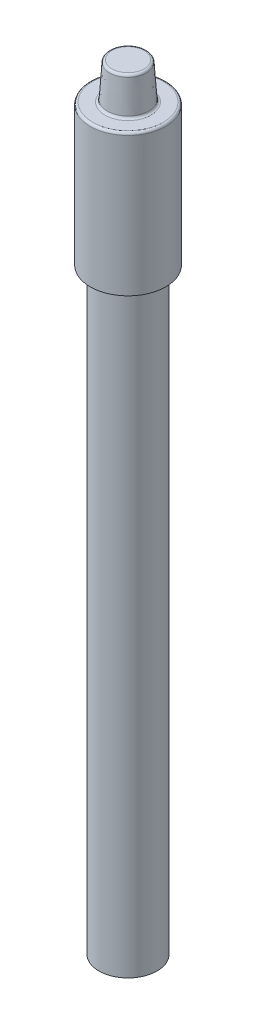
ISO-10303-21;
HEADER;
FILE_DESCRIPTION(('STEP AP214'),'2;1');
FILE_NAME('part.step','',(''),(''),'','','');
FILE_SCHEMA(('AUTOMOTIVE_DESIGN { 1 0 10303 214 1 1 1 1 }'));
ENDSEC;
DATA;
#1=APPLICATION_CONTEXT('core data for automotive mechanical design processes');
#2=APPLICATION_PROTOCOL_DEFINITION('international standard','automotive_design',2000,#1);
#3=PRODUCT_CONTEXT('',#1,'mechanical');
#4=PRODUCT('Part','Part','',(#3));
#5=PRODUCT_RELATED_PRODUCT_CATEGORY('part','',(#4));
#6=PRODUCT_DEFINITION_FORMATION('','',#4);
#7=PRODUCT_DEFINITION_CONTEXT('part definition',#1,'design');
#8=PRODUCT_DEFINITION('design','',#6,#7);
#9=PRODUCT_DEFINITION_SHAPE('','',#8);
#10=(LENGTH_UNIT() NAMED_UNIT(*) SI_UNIT(.MILLI.,.METRE.));
#11=(NAMED_UNIT(*) PLANE_ANGLE_UNIT() SI_UNIT($,.RADIAN.));
#12=(NAMED_UNIT(*) SI_UNIT($,.STERADIAN.) SOLID_ANGLE_UNIT());
#13=UNCERTAINTY_MEASURE_WITH_UNIT(LENGTH_MEASURE(1.E-05),#10,'distance_accuracy_value','');
#14=(GEOMETRIC_REPRESENTATION_CONTEXT(3) GLOBAL_UNCERTAINTY_ASSIGNED_CONTEXT((#13)) GLOBAL_UNIT_ASSIGNED_CONTEXT((#10,
#11,#12)) REPRESENTATION_CONTEXT('',''));
#15=CARTESIAN_POINT('',(0.,0.,0.));
#16=DIRECTION('',(0.,0.,1.));
#17=DIRECTION('',(1.,0.,0.));
#18=AXIS2_PLACEMENT_3D('',#15,#16,#17);
#19=CARTESIAN_POINT('',(0.,161.544,0.));
#20=DIRECTION('',(0.,1.,0.));
#21=DIRECTION('',(0.,0.,1.));
#22=AXIS2_PLACEMENT_3D('',#19,#20,#21);
#23=PLANE('',#22);
#24=CARTESIAN_POINT('',(0.,161.544,0.));
#25=DIRECTION('',(0.,1.,0.));
#26=DIRECTION('',(0.,0.,1.));
#27=AXIS2_PLACEMENT_3D('',#24,#25,#26);
#28=CIRCLE('',#27,3.3347390293191);
#29=CARTESIAN_POINT('',(0.,161.544,3.3347390293191));
#30=VERTEX_POINT('',#29);
#31=EDGE_CURVE('E154',#30,#30,#28,.T.);
#32=ORIENTED_EDGE('',*,*,#31,.T.);
#33=EDGE_LOOP('',(#32));
#34=FACE_BOUND('',#33,.T.);
#35=ADVANCED_FACE('F38',(#34),#23,.T.);
#36=CARTESIAN_POINT('',(0.,153.924,0.));
#37=DIRECTION('',(0.,-1.,0.));
#38=DIRECTION('',(0.,0.,-1.));
#39=AXIS2_PLACEMENT_3D('',#36,#37,#38);
#40=CONICAL_SURFACE('',#39,4.318,0.0665681637758242);
#41=CARTESIAN_POINT('',(0.,161.069791657346,0.));
#42=DIRECTION('',(0.,1.,0.));
#43=DIRECTION('',(0.,0.,1.));
#44=AXIS2_PLACEMENT_3D('',#41,#42,#43);
#45=CIRCLE('',#44,3.84161388951026);
#46=CARTESIAN_POINT('',(0.,161.069791657346,3.84161388951026));
#47=VERTEX_POINT('',#46);
#48=EDGE_CURVE('E151',#47,#47,#45,.F.);
#49=ORIENTED_EDGE('',*,*,#48,.T.);
#50=EDGE_LOOP('',(#49));
#51=FACE_BOUND('',#50,.T.);
#52=CARTESIAN_POINT('',(0.,154.398208342654,0.));
#53=DIRECTION('',(0.,-1.,0.));
#54=DIRECTION('',(0.,0.,-1.));
#55=AXIS2_PLACEMENT_3D('',#52,#53,#54);
#56=CIRCLE('',#55,4.28638611048974);
#57=CARTESIAN_POINT('',(0.,154.398208342654,-4.28638611048974));
#58=VERTEX_POINT('',#57);
#59=EDGE_CURVE('E148',#58,#58,#56,.F.);
#60=ORIENTED_EDGE('',*,*,#59,.T.);
#61=EDGE_LOOP('',(#60));
#62=FACE_BOUND('',#61,.T.);
#63=ADVANCED_FACE('F174',(#51,#62),#40,.T.);
#64=CARTESIAN_POINT('',(4.318,153.924,0.));
#65=DIRECTION('',(0.,1.,0.));
#66=DIRECTION('',(0.,0.,1.));
#67=AXIS2_PLACEMENT_3D('',#64,#65,#66);
#68=PLANE('',#67);
#69=CARTESIAN_POINT('',(0.,153.924,0.));
#70=DIRECTION('',(0.,1.,0.));
#71=DIRECTION('',(0.,0.,1.));
#72=AXIS2_PLACEMENT_3D('',#69,#70,#71);
#73=CIRCLE('',#72,7.36599999999999);
#74=CARTESIAN_POINT('',(0.,153.924,7.36599999999999));
#75=VERTEX_POINT('',#74);
#76=EDGE_CURVE('E11',#75,#75,#73,.T.);
#77=ORIENTED_EDGE('',*,*,#76,.T.);
#78=EDGE_LOOP('',(#77));
#79=FACE_BOUND('',#78,.T.);
#80=CARTESIAN_POINT('',(0.,153.924,0.));
#81=DIRECTION('',(0.,1.,0.));
#82=DIRECTION('',(0.,0.,1.));
#83=AXIS2_PLACEMENT_3D('',#80,#81,#82);
#84=CIRCLE('',#83,4.79326097068089);
#85=CARTESIAN_POINT('',(0.,153.924,4.79326097068089));
#86=VERTEX_POINT('',#85);
#87=EDGE_CURVE('E46',#86,#86,#84,.F.);
#88=ORIENTED_EDGE('',*,*,#87,.T.);
#89=EDGE_LOOP('',(#88));
#90=FACE_BOUND('',#89,.T.);
#91=ADVANCED_FACE('F162',(#79,#90),#68,.T.);
#92=CARTESIAN_POINT('',(0.,0.,0.));
#93=DIRECTION('',(0.,-1.,0.));
#94=DIRECTION('',(0.,0.,-1.));
#95=AXIS2_PLACEMENT_3D('',#92,#93,#94);
#96=CYLINDRICAL_SURFACE('',#95,7.87399999999999);
#97=CARTESIAN_POINT('',(0.,153.416,0.));
#98=DIRECTION('',(0.,1.,0.));
#99=DIRECTION('',(0.,0.,1.));
#100=AXIS2_PLACEMENT_3D('',#97,#98,#99);
#101=CIRCLE('',#100,7.87399999999999);
#102=CARTESIAN_POINT('',(0.,153.416,7.87399999999999));
#103=VERTEX_POINT('',#102);
#104=EDGE_CURVE('E157',#103,#103,#101,.F.);
#105=ORIENTED_EDGE('',*,*,#104,.T.);
#106=EDGE_LOOP('',(#105));
#107=FACE_BOUND('',#106,.T.);
#108=CARTESIAN_POINT('',(0.,124.46,0.));
#109=DIRECTION('',(0.,-1.,0.));
#110=DIRECTION('',(0.,0.,-1.));
#111=AXIS2_PLACEMENT_3D('',#108,#109,#110);
#112=CIRCLE('',#111,7.87399999999999);
#113=CARTESIAN_POINT('',(0.,124.46,-7.87399999999999));
#114=VERTEX_POINT('',#113);
#115=EDGE_CURVE('E112',#114,#114,#112,.T.);
#116=ORIENTED_EDGE('',*,*,#115,.F.);
#117=EDGE_LOOP('',(#116));
#118=FACE_BOUND('',#117,.T.);
#119=ADVANCED_FACE('F232',(#107,#118),#96,.T.);
#120=CARTESIAN_POINT('',(7.87399999999999,124.46,0.));
#121=DIRECTION('',(0.,-1.,0.));
#122=DIRECTION('',(0.,0.,-1.));
#123=AXIS2_PLACEMENT_3D('',#120,#121,#122);
#124=PLANE('',#123);
#125=ORIENTED_EDGE('',*,*,#115,.T.);
#126=EDGE_LOOP('',(#125));
#127=FACE_BOUND('',#126,.T.);
#128=CARTESIAN_POINT('',(0.,124.46,0.));
#129=DIRECTION('',(0.,-1.,0.));
#130=DIRECTION('',(0.,0.,-1.));
#131=AXIS2_PLACEMENT_3D('',#128,#129,#130);
#132=CIRCLE('',#131,6.0579);
#133=CARTESIAN_POINT('',(0.,124.46,-6.0579));
#134=VERTEX_POINT('',#133);
#135=EDGE_CURVE('E109',#134,#134,#132,.T.);
#136=ORIENTED_EDGE('',*,*,#135,.F.);
#137=EDGE_LOOP('',(#136));
#138=FACE_BOUND('',#137,.T.);
#139=ADVANCED_FACE('F226',(#127,#138),#124,.T.);
#140=CARTESIAN_POINT('',(0.,0.,0.));
#141=DIRECTION('',(0.,-1.,0.));
#142=DIRECTION('',(0.,0.,-1.));
#143=AXIS2_PLACEMENT_3D('',#140,#141,#142);
#144=CYLINDRICAL_SURFACE('',#143,6.05790000000001);
#145=CARTESIAN_POINT('',(1.58750000000005,7.9375,-5.84619501556354));
#146=CARTESIAN_POINT('',(1.58750061817418,7.89365962098616,-5.84619188560086));
#147=CARTESIAN_POINT('',(1.58568279812585,7.84984104344828,-5.84668877811638));
#148=CARTESIAN_POINT('',(1.57843677185581,7.76253308876318,-5.8486503359072));
#149=CARTESIAN_POINT('',(1.57300921823965,7.71904365354727,-5.85011482624968));
#150=CARTESIAN_POINT('',(1.55139376457527,7.58973118774355,-5.85590005150811));
#151=CARTESIAN_POINT('',(1.52987269952165,7.50479914665635,-5.86161292252862));
#152=CARTESIAN_POINT('',(1.47331526579524,7.33991592131275,-5.87608155673797));
#153=CARTESIAN_POINT('',(1.43828093544801,7.2599639879741,-5.88483686098992));
#154=CARTESIAN_POINT('',(1.3557372018994,7.10702817141382,-5.90439858006232));
#155=CARTESIAN_POINT('',(1.30822389684619,7.0340464773551,-5.91520563611893));
#156=CARTESIAN_POINT('',(1.20085729830548,6.89540986022277,-5.93794256287849));
#157=CARTESIAN_POINT('',(1.14075901523521,6.82994787127658,-5.94989168333718));
#158=CARTESIAN_POINT('',(1.01045023841356,6.70990250882768,-5.97340099888662));
#159=CARTESIAN_POINT('',(0.940238113658851,6.65532089333349,-5.98496113087571));
#160=CARTESIAN_POINT('',(0.790355963367382,6.55778674504898,-6.00660485695718));
#161=CARTESIAN_POINT('',(0.710556754336924,6.51502657930266,-6.01666292469447));
#162=CARTESIAN_POINT('',(0.544598485479338,6.44360404671197,-6.03394680972707));
#163=CARTESIAN_POINT('',(0.458440768131531,6.41493871374666,-6.0411732228516));
#164=CARTESIAN_POINT('',(0.284233026650596,6.37314297486942,-6.05184332388443));
#165=CARTESIAN_POINT('',(0.196267178797236,6.35968255724433,-6.05536724811707));
#166=CARTESIAN_POINT('',(0.0192580861660801,6.34764102921661,-6.05851563482507));
#167=CARTESIAN_POINT('',(-0.0697850060352034,6.34905783574785,-6.05814064321547));
#168=CARTESIAN_POINT('',(-0.244122361741189,6.36649732322294,-6.05359235027768));
#169=CARTESIAN_POINT('',(-0.329455102533652,6.3821632361642,-6.04951183162787));
#170=CARTESIAN_POINT('',(-0.496234673819479,6.42708051237455,-6.03812011323158));
#171=CARTESIAN_POINT('',(-0.577681323133316,6.45633250838042,-6.03080876301821));
#172=CARTESIAN_POINT('',(-0.735297572739677,6.52786965299533,-6.01363795596316));
#173=CARTESIAN_POINT('',(-0.811408288302789,6.57027853273941,-6.00375445846833));
#174=CARTESIAN_POINT('',(-0.955553824432183,6.66683028431112,-5.9825066156688));
#175=CARTESIAN_POINT('',(-1.02358728433701,6.72097512880278,-5.97114202153911));
#176=CARTESIAN_POINT('',(-1.15177092662705,6.84135364829278,-5.94776859365536));
#177=CARTESIAN_POINT('',(-1.21162848744778,6.90789746569458,-5.93575064682512));
#178=CARTESIAN_POINT('',(-1.31941778155034,7.05022231279608,-5.91272665751376));
#179=CARTESIAN_POINT('',(-1.36734622789419,7.12600587985767,-5.90172089445441));
#180=CARTESIAN_POINT('',(-1.45013365920058,7.28528907872724,-5.88192951142475));
#181=CARTESIAN_POINT('',(-1.48490832985518,7.36883435069013,-5.87315832801325));
#182=CARTESIAN_POINT('',(-1.53978013194434,7.54082385555572,-5.85901407551515));
#183=CARTESIAN_POINT('',(-1.55989927867681,7.62926052474669,-5.85363591112307));
#184=CARTESIAN_POINT('',(-1.57739990738407,7.75498141021157,-5.84892990050259));
#185=CARTESIAN_POINT('',(-1.58118787740466,7.79140419057251,-5.84790604453954));
#186=CARTESIAN_POINT('',(-1.58623519374438,7.86437879051187,-5.84653882367214));
#187=CARTESIAN_POINT('',(-1.587498567608,7.90093031121982,-5.84619437490574));
#188=CARTESIAN_POINT('',(-1.58749999999995,7.9375,-5.84619501556357));
#189=B_SPLINE_CURVE_WITH_KNOTS('',3,(#145,#146,#147,#148,#149,#150,#151,#152,#153,#154,#155,
#156,#157,#158,#159,#160,#161,#162,#163,#164,#165,#166,#167,#168,#169,#170,#171,#172,#173,#174,
#175,#176,#177,#178,#179,#180,#181,#182,#183,#184,#185,#186,#187,#188),.UNSPECIFIED.,.F.,.F.,(4,
2,2,2,2,2,2,2,2,2,2,2,2,2,2,2,2,2,2,2,2,4),(0.,0.131437805911336,0.26285185557208,
0.524895805971718,0.786900245407655,1.04898670456866,1.31674986891122,1.58455626238151,
1.85649360578892,2.12837369809976,2.39423208594019,2.66005324955044,2.91939668821192,
3.17875220633671,3.44062476035057,3.70254136593904,3.97220340907806,4.24193967261308,
4.51337674269782,4.7844052186535,4.89423013162933,5.00387969815233),.UNSPECIFIED.);
#190=CARTESIAN_POINT('',(1.58750000000002,7.9375,-5.84619501556355));
#191=VERTEX_POINT('',#190);
#192=CARTESIAN_POINT('',(-1.58749999999998,7.9375,-5.84619501556356));
#193=VERTEX_POINT('',#192);
#194=EDGE_CURVE('E61',#191,#193,#189,.T.);
#195=ORIENTED_EDGE('',*,*,#194,.F.);
#196=DIRECTION('',(0.,-1.,0.));
#197=VECTOR('',#196,1.);
#198=CARTESIAN_POINT('',(1.58750000000003,0.,-5.84619501556355));
#199=LINE('',#198,#197);
#200=CARTESIAN_POINT('',(1.58750000000003,10.8585,-5.84619501556355));
#201=VERTEX_POINT('',#200);
#202=EDGE_CURVE('E82',#201,#191,#199,.T.);
#203=ORIENTED_EDGE('',*,*,#202,.F.);
#204=CARTESIAN_POINT('',(-1.58749999999998,10.8585,-5.84619501556356));
#205=CARTESIAN_POINT('',(-1.58750061817411,10.9023403790138,-5.84619188560088));
#206=CARTESIAN_POINT('',(-1.58568279812578,10.9461589565517,-5.84668877811639));
#207=CARTESIAN_POINT('',(-1.57843677185574,11.0334669112368,-5.84865033590722));
#208=CARTESIAN_POINT('',(-1.57300921823958,11.0769563464527,-5.8501148262497));
#209=CARTESIAN_POINT('',(-1.55139376457519,11.2062688122565,-5.85590005150813));
#210=CARTESIAN_POINT('',(-1.52987269952158,11.2912008533437,-5.86161292252864));
#211=CARTESIAN_POINT('',(-1.47331526579517,11.4560840786872,-5.876081556738));
#212=CARTESIAN_POINT('',(-1.43828093544794,11.5360360120259,-5.88483686098994));
#213=CARTESIAN_POINT('',(-1.35573720189933,11.6889718285862,-5.90439858006233));
#214=CARTESIAN_POINT('',(-1.30822389684612,11.7619535226449,-5.91520563611895));
#215=CARTESIAN_POINT('',(-1.20085729830541,11.9005901397772,-5.93794256287851));
#216=CARTESIAN_POINT('',(-1.14075901523514,11.9660521287234,-5.9498916833372));
#217=CARTESIAN_POINT('',(-1.01045023841349,12.0860974911723,-5.97340099888663));
#218=CARTESIAN_POINT('',(-0.940238113658778,12.1406791066665,-5.98496113087572));
#219=CARTESIAN_POINT('',(-0.790355963367308,12.238213254951,-6.00660485695719));
#220=CARTESIAN_POINT('',(-0.71055675433685,12.2809734206973,-6.01666292469448));
#221=CARTESIAN_POINT('',(-0.544598485479265,12.352395953288,-6.03394680972708));
#222=CARTESIAN_POINT('',(-0.458440768131458,12.3810612862533,-6.04117322285161));
#223=CARTESIAN_POINT('',(-0.284233026650524,12.4228570251306,-6.05184332388443));
#224=CARTESIAN_POINT('',(-0.196267178797164,12.4363174427557,-6.05536724811707));
#225=CARTESIAN_POINT('',(-0.0192580861660087,12.4483589707834,-6.05851563482507));
#226=CARTESIAN_POINT('',(0.0697850060352745,12.4469421642522,-6.05814064321547));
#227=CARTESIAN_POINT('',(0.24412236174126,12.4295026767771,-6.05359235027767));
#228=CARTESIAN_POINT('',(0.329455102533723,12.4138367638358,-6.04951183162787));
#229=CARTESIAN_POINT('',(0.496234673819549,12.3689194876254,-6.03812011323157));
#230=CARTESIAN_POINT('',(0.577681323133386,12.3396674916196,-6.0308087630182));
#231=CARTESIAN_POINT('',(0.735297572739746,12.2681303470047,-6.01363795596316));
#232=CARTESIAN_POINT('',(0.811408288302857,12.2257214672606,-6.00375445846832));
#233=CARTESIAN_POINT('',(0.955553824432252,12.1291697156889,-5.98250661566879));
#234=CARTESIAN_POINT('',(1.02358728433708,12.0750248711972,-5.9711420215391));
#235=CARTESIAN_POINT('',(1.15177092662711,11.9546463517072,-5.94776859365535));
#236=CARTESIAN_POINT('',(1.21162848744785,11.8881025343054,-5.93575064682511));
#237=CARTESIAN_POINT('',(1.31941778155041,11.7457776872039,-5.91272665751374));
#238=CARTESIAN_POINT('',(1.36734622789426,11.6699941201423,-5.90172089445439));
#239=CARTESIAN_POINT('',(1.45013365920065,11.5107109212728,-5.88192951142473));
#240=CARTESIAN_POINT('',(1.48490832985525,11.4271656493099,-5.87315832801323));
#241=CARTESIAN_POINT('',(1.53978013194441,11.2551761444443,-5.85901407551513));
#242=CARTESIAN_POINT('',(1.55989927867688,11.1667394752533,-5.85363591112305));
#243=CARTESIAN_POINT('',(1.57739990738414,11.0410185897884,-5.84892990050257));
#244=CARTESIAN_POINT('',(1.58118787740473,11.0045958094275,-5.84790604453952));
#245=CARTESIAN_POINT('',(1.58623519374445,10.9316212094881,-5.84653882367212));
#246=CARTESIAN_POINT('',(1.58749856760807,10.8950696887802,-5.84619437490572));
#247=CARTESIAN_POINT('',(1.58750000000002,10.8585,-5.84619501556355));
#248=B_SPLINE_CURVE_WITH_KNOTS('',3,(#204,#205,#206,#207,#208,#209,#210,#211,#212,#213,#214,
#215,#216,#217,#218,#219,#220,#221,#222,#223,#224,#225,#226,#227,#228,#229,#230,#231,#232,#233,
#234,#235,#236,#237,#238,#239,#240,#241,#242,#243,#244,#245,#246,#247),.UNSPECIFIED.,.F.,.F.,(4,
2,2,2,2,2,2,2,2,2,2,2,2,2,2,2,2,2,2,2,2,4),(0.,0.131437805911337,0.26285185557208,
0.524895805971718,0.786900245407655,1.04898670456866,1.31674986891122,1.58455626238151,
1.85649360578892,2.12837369809976,2.39423208594018,2.66005324955044,2.91939668821192,
3.1787522063367,3.44062476035057,3.70254136593903,3.97220340907806,4.24193967261307,
4.51337674269782,4.78440521865349,4.89423013162932,5.00387969815232),.UNSPECIFIED.);
#249=CARTESIAN_POINT('',(-1.58749999999998,10.8585,-5.84619501556356));
#250=VERTEX_POINT('',#249);
#251=EDGE_CURVE('E116',#250,#201,#248,.T.);
#252=ORIENTED_EDGE('',*,*,#251,.F.);
#253=DIRECTION('',(0.,-1.,0.));
#254=VECTOR('',#253,1.);
#255=CARTESIAN_POINT('',(-1.58749999999998,0.,-5.84619501556356));
#256=LINE('',#255,#254);
#257=EDGE_CURVE('E124',#193,#250,#256,.F.);
#258=ORIENTED_EDGE('',*,*,#257,.F.);
#259=EDGE_LOOP('',(#195,#203,#252,#258));
#260=FACE_BOUND('',#259,.T.);
#261=ORIENTED_EDGE('',*,*,#135,.T.);
#262=EDGE_LOOP('',(#261));
#263=FACE_BOUND('',#262,.T.);
#264=CARTESIAN_POINT('',(0.,0.,0.));
#265=DIRECTION('',(0.,-1.,0.));
#266=DIRECTION('',(0.,0.,-1.));
#267=AXIS2_PLACEMENT_3D('',#264,#265,#266);
#268=CIRCLE('',#267,6.05790000000002);
#269=CARTESIAN_POINT('',(0.,0.,-6.05790000000002));
#270=VERTEX_POINT('',#269);
#271=EDGE_CURVE('E103',#270,#270,#268,.T.);
#272=ORIENTED_EDGE('',*,*,#271,.F.);
#273=EDGE_LOOP('',(#272));
#274=FACE_BOUND('',#273,.T.);
#275=ADVANCED_FACE('F126',(#260,#263,#274),#144,.T.);
#276=CARTESIAN_POINT('',(6.05790000000002,0.,0.));
#277=DIRECTION('',(0.,-1.,0.));
#278=DIRECTION('',(0.,0.,-1.));
#279=AXIS2_PLACEMENT_3D('',#276,#277,#278);
#280=PLANE('',#279);
#281=ORIENTED_EDGE('',*,*,#271,.T.);
#282=EDGE_LOOP('',(#281));
#283=FACE_BOUND('',#282,.T.);
#284=ADVANCED_FACE('F142',(#283),#280,.T.);
#285=CARTESIAN_POINT('',(0.,7.9375,-7.87399999999999));
#286=DIRECTION('',(0.,0.,1.));
#287=DIRECTION('',(1.,0.,0.));
#288=AXIS2_PLACEMENT_3D('',#285,#286,#287);
#289=CYLINDRICAL_SURFACE('',#288,1.5875);
#290=ORIENTED_EDGE('',*,*,#194,.T.);
#291=DIRECTION('',(0.,0.,1.));
#292=VECTOR('',#291,1.);
#293=CARTESIAN_POINT('',(-1.58749999999998,7.9375,-7.87399999999999));
#294=LINE('',#293,#292);
#295=CARTESIAN_POINT('',(-1.58749999999998,7.9375,0.));
#296=VERTEX_POINT('',#295);
#297=EDGE_CURVE('E97',#193,#296,#294,.T.);
#298=ORIENTED_EDGE('',*,*,#297,.T.);
#299=CARTESIAN_POINT('',(0.,7.9375,0.));
#300=DIRECTION('',(0.,0.,1.));
#301=DIRECTION('',(1.,0.,0.));
#302=AXIS2_PLACEMENT_3D('',#299,#300,#301);
#303=CIRCLE('',#302,1.5875);
#304=CARTESIAN_POINT('',(1.58750000000002,7.9375,0.));
#305=VERTEX_POINT('',#304);
#306=EDGE_CURVE('E91',#296,#305,#303,.T.);
#307=ORIENTED_EDGE('',*,*,#306,.T.);
#308=DIRECTION('',(0.,0.,1.));
#309=VECTOR('',#308,1.);
#310=CARTESIAN_POINT('',(1.58750000000002,7.9375,-7.87399999999999));
#311=LINE('',#310,#309);
#312=EDGE_CURVE('E77',#191,#305,#311,.T.);
#313=ORIENTED_EDGE('',*,*,#312,.F.);
#314=EDGE_LOOP('',(#290,#298,#307,#313));
#315=FACE_BOUND('',#314,.T.);
#316=ADVANCED_FACE('F96',(#315),#289,.F.);
#317=CARTESIAN_POINT('',(-1.58749999999998,7.9375,-7.87399999999999));
#318=DIRECTION('',(-1.,0.,0.));
#319=DIRECTION('',(0.,-1.,0.));
#320=AXIS2_PLACEMENT_3D('',#317,#318,#319);
#321=PLANE('',#320);
#322=ORIENTED_EDGE('',*,*,#257,.T.);
#323=DIRECTION('',(0.,0.,1.));
#324=VECTOR('',#323,1.);
#325=CARTESIAN_POINT('',(-1.58749999999998,10.8585,-7.87399999999999));
#326=LINE('',#325,#324);
#327=CARTESIAN_POINT('',(-1.58749999999998,10.8585,0.));
#328=VERTEX_POINT('',#327);
#329=EDGE_CURVE('E104',#250,#328,#326,.T.);
#330=ORIENTED_EDGE('',*,*,#329,.T.);
#331=DIRECTION('',(0.,-1.,0.));
#332=VECTOR('',#331,1.);
#333=CARTESIAN_POINT('',(-1.58749999999998,7.9375,0.));
#334=LINE('',#333,#332);
#335=EDGE_CURVE('E84',#328,#296,#334,.T.);
#336=ORIENTED_EDGE('',*,*,#335,.T.);
#337=ORIENTED_EDGE('',*,*,#297,.F.);
#338=EDGE_LOOP('',(#322,#330,#336,#337));
#339=FACE_BOUND('',#338,.T.);
#340=ADVANCED_FACE('F135',(#339),#321,.F.);
#341=CARTESIAN_POINT('',(0.,10.8585,-7.87399999999999));
#342=DIRECTION('',(0.,0.,1.));
#343=DIRECTION('',(1.,0.,0.));
#344=AXIS2_PLACEMENT_3D('',#341,#342,#343);
#345=CYLINDRICAL_SURFACE('',#344,1.5875);
#346=ORIENTED_EDGE('',*,*,#251,.T.);
#347=DIRECTION('',(0.,0.,1.));
#348=VECTOR('',#347,1.);
#349=CARTESIAN_POINT('',(1.58750000000002,10.8585,-7.87399999999999));
#350=LINE('',#349,#348);
#351=CARTESIAN_POINT('',(1.58750000000002,10.8585,0.));
#352=VERTEX_POINT('',#351);
#353=EDGE_CURVE('E53',#201,#352,#350,.T.);
#354=ORIENTED_EDGE('',*,*,#353,.T.);
#355=CARTESIAN_POINT('',(0.,10.8585,0.));
#356=DIRECTION('',(0.,0.,1.));
#357=DIRECTION('',(1.,0.,0.));
#358=AXIS2_PLACEMENT_3D('',#355,#356,#357);
#359=CIRCLE('',#358,1.5875);
#360=EDGE_CURVE('E94',#352,#328,#359,.T.);
#361=ORIENTED_EDGE('',*,*,#360,.T.);
#362=ORIENTED_EDGE('',*,*,#329,.F.);
#363=EDGE_LOOP('',(#346,#354,#361,#362));
#364=FACE_BOUND('',#363,.T.);
#365=ADVANCED_FACE('F130',(#364),#345,.F.);
#366=CARTESIAN_POINT('',(1.58750000000002,7.9375,-7.87399999999999));
#367=DIRECTION('',(1.,0.,0.));
#368=DIRECTION('',(0.,1.,0.));
#369=AXIS2_PLACEMENT_3D('',#366,#367,#368);
#370=PLANE('',#369);
#371=ORIENTED_EDGE('',*,*,#202,.T.);
#372=ORIENTED_EDGE('',*,*,#312,.T.);
#373=DIRECTION('',(0.,1.,0.));
#374=VECTOR('',#373,1.);
#375=CARTESIAN_POINT('',(1.58750000000002,7.9375,0.));
#376=LINE('',#375,#374);
#377=EDGE_CURVE('E80',#305,#352,#376,.T.);
#378=ORIENTED_EDGE('',*,*,#377,.T.);
#379=ORIENTED_EDGE('',*,*,#353,.F.);
#380=EDGE_LOOP('',(#371,#372,#378,#379));
#381=FACE_BOUND('',#380,.T.);
#382=ADVANCED_FACE('F79',(#381),#370,.F.);
#383=CARTESIAN_POINT('',(0.,7.9375,0.));
#384=DIRECTION('',(0.,0.,1.));
#385=DIRECTION('',(1.,0.,0.));
#386=AXIS2_PLACEMENT_3D('',#383,#384,#385);
#387=PLANE('',#386);
#388=ORIENTED_EDGE('',*,*,#306,.F.);
#389=ORIENTED_EDGE('',*,*,#335,.F.);
#390=ORIENTED_EDGE('',*,*,#360,.F.);
#391=ORIENTED_EDGE('',*,*,#377,.F.);
#392=EDGE_LOOP('',(#388,#389,#390,#391));
#393=FACE_BOUND('',#392,.T.);
#394=ADVANCED_FACE('F89',(#393),#387,.F.);
#395=CARTESIAN_POINT('',(0.,161.036,0.));
#396=DIRECTION('',(0.,1.,0.));
#397=DIRECTION('',(0.,0.,1.));
#398=AXIS2_PLACEMENT_3D('',#395,#396,#397);
#399=TOROIDAL_SURFACE('',#398,3.3347390293191,0.508);
#400=ORIENTED_EDGE('',*,*,#31,.F.);
#401=EDGE_LOOP('',(#400));
#402=FACE_BOUND('',#401,.T.);
#403=ORIENTED_EDGE('',*,*,#48,.F.);
#404=EDGE_LOOP('',(#403));
#405=FACE_BOUND('',#404,.T.);
#406=ADVANCED_FACE('F170',(#402,#405),#399,.T.);
#407=CARTESIAN_POINT('',(0.,153.416,0.));
#408=DIRECTION('',(0.,1.,0.));
#409=DIRECTION('',(0.,0.,1.));
#410=AXIS2_PLACEMENT_3D('',#407,#408,#409);
#411=TOROIDAL_SURFACE('',#410,7.36599999999999,0.508);
#412=ORIENTED_EDGE('',*,*,#76,.F.);
#413=EDGE_LOOP('',(#412));
#414=FACE_BOUND('',#413,.T.);
#415=ORIENTED_EDGE('',*,*,#104,.F.);
#416=EDGE_LOOP('',(#415));
#417=FACE_BOUND('',#416,.T.);
#418=ADVANCED_FACE('F165',(#414,#417),#411,.T.);
#419=CARTESIAN_POINT('',(0.,154.432,0.));
#420=DIRECTION('',(0.,1.,0.));
#421=DIRECTION('',(0.,0.,1.));
#422=AXIS2_PLACEMENT_3D('',#419,#420,#421);
#423=TOROIDAL_SURFACE('',#422,4.79326097068089,0.508);
#424=ORIENTED_EDGE('',*,*,#59,.F.);
#425=EDGE_LOOP('',(#424));
#426=FACE_BOUND('',#425,.T.);
#427=ORIENTED_EDGE('',*,*,#87,.F.);
#428=EDGE_LOOP('',(#427));
#429=FACE_BOUND('',#428,.T.);
#430=ADVANCED_FACE('F40',(#426,#429),#423,.F.);
#431=CLOSED_SHELL('',(#35,#63,#91,#119,#139,#275,#284,#316,#340,#365,#382,#394,#406,#418,#430));
#432=MANIFOLD_SOLID_BREP('B2',#431);
#433=ADVANCED_BREP_SHAPE_REPRESENTATION('',(#18,#432),#14);
#434=SHAPE_DEFINITION_REPRESENTATION(#9,#433);
ENDSEC;
END-ISO-10303-21;
